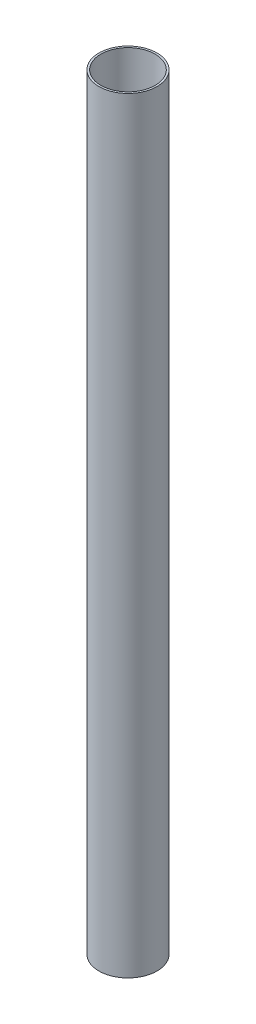
ISO-10303-21;
HEADER;
FILE_DESCRIPTION(('STEP AP214'),'2;1');
FILE_NAME('part.step','',(''),(''),'','','');
FILE_SCHEMA(('AUTOMOTIVE_DESIGN { 1 0 10303 214 1 1 1 1 }'));
ENDSEC;
DATA;
#1=APPLICATION_CONTEXT('core data for automotive mechanical design processes');
#2=APPLICATION_PROTOCOL_DEFINITION('international standard','automotive_design',2000,#1);
#3=PRODUCT_CONTEXT('',#1,'mechanical');
#4=PRODUCT('Part','Part','',(#3));
#5=PRODUCT_RELATED_PRODUCT_CATEGORY('part','',(#4));
#6=PRODUCT_DEFINITION_FORMATION('','',#4);
#7=PRODUCT_DEFINITION_CONTEXT('part definition',#1,'design');
#8=PRODUCT_DEFINITION('design','',#6,#7);
#9=PRODUCT_DEFINITION_SHAPE('','',#8);
#10=(LENGTH_UNIT() NAMED_UNIT(*) SI_UNIT(.MILLI.,.METRE.));
#11=(NAMED_UNIT(*) PLANE_ANGLE_UNIT() SI_UNIT($,.RADIAN.));
#12=(NAMED_UNIT(*) SI_UNIT($,.STERADIAN.) SOLID_ANGLE_UNIT());
#13=UNCERTAINTY_MEASURE_WITH_UNIT(LENGTH_MEASURE(1.E-05),#10,'distance_accuracy_value','');
#14=(GEOMETRIC_REPRESENTATION_CONTEXT(3) GLOBAL_UNCERTAINTY_ASSIGNED_CONTEXT((#13)) GLOBAL_UNIT_ASSIGNED_CONTEXT((#10,
#11,#12)) REPRESENTATION_CONTEXT('',''));
#15=CARTESIAN_POINT('',(0.,0.,0.));
#16=DIRECTION('',(0.,0.,1.));
#17=DIRECTION('',(1.,0.,0.));
#18=AXIS2_PLACEMENT_3D('',#15,#16,#17);
#19=CARTESIAN_POINT('',(0.,0.,0.));
#20=DIRECTION('',(0.,1.,0.));
#21=DIRECTION('',(0.,0.,1.));
#22=AXIS2_PLACEMENT_3D('',#19,#20,#21);
#23=CYLINDRICAL_SURFACE('',#22,26.9875000000244);
#24=CARTESIAN_POINT('',(0.,-721.61376711629,0.));
#25=DIRECTION('',(0.,1.,0.));
#26=DIRECTION('',(0.,0.,1.));
#27=AXIS2_PLACEMENT_3D('',#24,#25,#26);
#28=CIRCLE('',#27,26.9875000000245);
#29=CARTESIAN_POINT('',(0.,-721.61376711629,26.9875000000245));
#30=VERTEX_POINT('',#29);
#31=EDGE_CURVE('E10',#30,#30,#28,.T.);
#32=ORIENTED_EDGE('',*,*,#31,.F.);
#33=EDGE_LOOP('',(#32));
#34=FACE_BOUND('',#33,.T.);
#35=CARTESIAN_POINT('',(0.,40.3862328837099,0.));
#36=DIRECTION('',(0.,1.,0.));
#37=DIRECTION('',(0.,0.,1.));
#38=AXIS2_PLACEMENT_3D('',#35,#36,#37);
#39=CIRCLE('',#38,26.9875000000244);
#40=CARTESIAN_POINT('',(0.,40.3862328837099,26.9875000000244));
#41=VERTEX_POINT('',#40);
#42=EDGE_CURVE('E57',#41,#41,#39,.T.);
#43=ORIENTED_EDGE('',*,*,#42,.T.);
#44=EDGE_LOOP('',(#43));
#45=FACE_BOUND('',#44,.T.);
#46=ADVANCED_FACE('F43',(#34,#45),#23,.F.);
#47=CARTESIAN_POINT('',(26.9875000000245,-721.61376711629,0.));
#48=DIRECTION('',(0.,1.,0.));
#49=DIRECTION('',(0.,0.,1.));
#50=AXIS2_PLACEMENT_3D('',#47,#48,#49);
#51=PLANE('',#50);
#52=CARTESIAN_POINT('',(0.,-721.61376711629,0.));
#53=DIRECTION('',(0.,1.,0.));
#54=DIRECTION('',(0.,0.,1.));
#55=AXIS2_PLACEMENT_3D('',#52,#53,#54);
#56=CIRCLE('',#55,28.9179000000001);
#57=CARTESIAN_POINT('',(0.,-721.61376711629,28.9179000000001));
#58=VERTEX_POINT('',#57);
#59=EDGE_CURVE('E49',#58,#58,#56,.T.);
#60=ORIENTED_EDGE('',*,*,#59,.F.);
#61=EDGE_LOOP('',(#60));
#62=FACE_BOUND('',#61,.T.);
#63=ORIENTED_EDGE('',*,*,#31,.T.);
#64=EDGE_LOOP('',(#63));
#65=FACE_BOUND('',#64,.T.);
#66=ADVANCED_FACE('F72',(#62,#65),#51,.F.);
#67=CARTESIAN_POINT('',(0.,0.,0.));
#68=DIRECTION('',(0.,1.,0.));
#69=DIRECTION('',(0.,0.,1.));
#70=AXIS2_PLACEMENT_3D('',#67,#68,#69);
#71=CYLINDRICAL_SURFACE('',#70,28.9179);
#72=CARTESIAN_POINT('',(0.,40.3862328837099,0.));
#73=DIRECTION('',(0.,1.,0.));
#74=DIRECTION('',(0.,0.,1.));
#75=AXIS2_PLACEMENT_3D('',#72,#73,#74);
#76=CIRCLE('',#75,28.9179);
#77=CARTESIAN_POINT('',(0.,40.3862328837099,28.9179));
#78=VERTEX_POINT('',#77);
#79=EDGE_CURVE('E53',#78,#78,#76,.T.);
#80=ORIENTED_EDGE('',*,*,#79,.F.);
#81=EDGE_LOOP('',(#80));
#82=FACE_BOUND('',#81,.T.);
#83=ORIENTED_EDGE('',*,*,#59,.T.);
#84=EDGE_LOOP('',(#83));
#85=FACE_BOUND('',#84,.T.);
#86=ADVANCED_FACE('F67',(#82,#85),#71,.T.);
#87=CARTESIAN_POINT('',(26.9875000000244,40.3862328837099,0.));
#88=DIRECTION('',(0.,-1.,0.));
#89=DIRECTION('',(0.,0.,-1.));
#90=AXIS2_PLACEMENT_3D('',#87,#88,#89);
#91=PLANE('',#90);
#92=ORIENTED_EDGE('',*,*,#42,.F.);
#93=EDGE_LOOP('',(#92));
#94=FACE_BOUND('',#93,.T.);
#95=ORIENTED_EDGE('',*,*,#79,.T.);
#96=EDGE_LOOP('',(#95));
#97=FACE_BOUND('',#96,.T.);
#98=ADVANCED_FACE('F64',(#94,#97),#91,.F.);
#99=CLOSED_SHELL('',(#46,#66,#86,#98));
#100=MANIFOLD_SOLID_BREP('B2',#99);
#101=ADVANCED_BREP_SHAPE_REPRESENTATION('',(#18,#100),#14);
#102=SHAPE_DEFINITION_REPRESENTATION(#9,#101);
ENDSEC;
END-ISO-10303-21;
